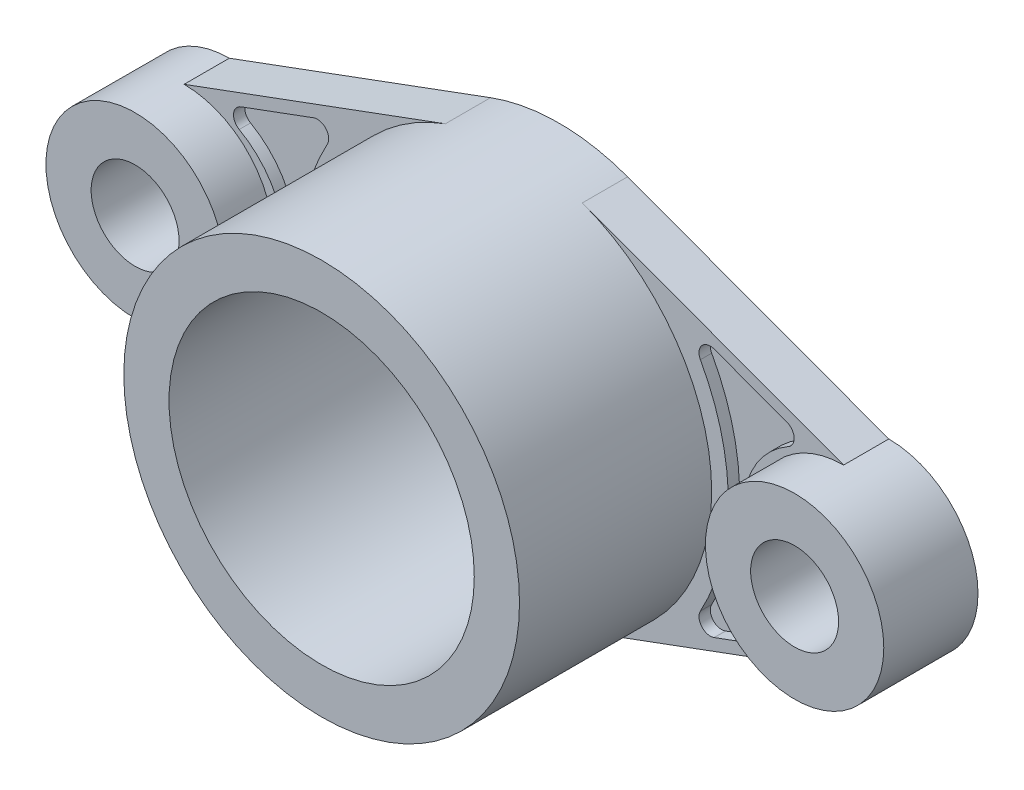
ISO-10303-21;
HEADER;
FILE_DESCRIPTION(('STEP AP214'),'2;1');
FILE_NAME('part.step','',(''),(''),'','','');
FILE_SCHEMA(('AUTOMOTIVE_DESIGN { 1 0 10303 214 1 1 1 1 }'));
ENDSEC;
DATA;
#1=APPLICATION_CONTEXT('core data for automotive mechanical design processes');
#2=APPLICATION_PROTOCOL_DEFINITION('international standard','automotive_design',2000,#1);
#3=PRODUCT_CONTEXT('',#1,'mechanical');
#4=PRODUCT('Part','Part','',(#3));
#5=PRODUCT_RELATED_PRODUCT_CATEGORY('part','',(#4));
#6=PRODUCT_DEFINITION_FORMATION('','',#4);
#7=PRODUCT_DEFINITION_CONTEXT('part definition',#1,'design');
#8=PRODUCT_DEFINITION('design','',#6,#7);
#9=PRODUCT_DEFINITION_SHAPE('','',#8);
#10=(LENGTH_UNIT() NAMED_UNIT(*) SI_UNIT(.MILLI.,.METRE.));
#11=(NAMED_UNIT(*) PLANE_ANGLE_UNIT() SI_UNIT($,.RADIAN.));
#12=(NAMED_UNIT(*) SI_UNIT($,.STERADIAN.) SOLID_ANGLE_UNIT());
#13=UNCERTAINTY_MEASURE_WITH_UNIT(LENGTH_MEASURE(1.E-05),#10,'distance_accuracy_value','');
#14=(GEOMETRIC_REPRESENTATION_CONTEXT(3) GLOBAL_UNCERTAINTY_ASSIGNED_CONTEXT((#13)) GLOBAL_UNIT_ASSIGNED_CONTEXT((#10,
#11,#12)) REPRESENTATION_CONTEXT('',''));
#15=CARTESIAN_POINT('',(0.,0.,0.));
#16=DIRECTION('',(0.,0.,1.));
#17=DIRECTION('',(1.,0.,0.));
#18=AXIS2_PLACEMENT_3D('',#15,#16,#17);
#19=CARTESIAN_POINT('',(0.,0.,63.));
#20=DIRECTION('',(0.,0.,-1.));
#21=DIRECTION('',(-1.,0.,0.));
#22=AXIS2_PLACEMENT_3D('',#19,#20,#21);
#23=CYLINDRICAL_SURFACE('',#22,52.5);
#24=CARTESIAN_POINT('',(0.,0.,63.));
#25=DIRECTION('',(0.,0.,1.));
#26=DIRECTION('',(1.,0.,0.));
#27=AXIS2_PLACEMENT_3D('',#24,#25,#26);
#28=CIRCLE('',#27,52.5);
#29=CARTESIAN_POINT('',(52.5,0.,63.));
#30=VERTEX_POINT('',#29);
#31=EDGE_CURVE('E12',#30,#30,#28,.T.);
#32=ORIENTED_EDGE('',*,*,#31,.F.);
#33=EDGE_LOOP('',(#32));
#34=FACE_BOUND('',#33,.T.);
#35=DIRECTION('',(0.,0.,-1.));
#36=VECTOR('',#35,1.);
#37=CARTESIAN_POINT('',(18.1794500378077,-49.251980633502,12.));
#38=LINE('',#37,#36);
#39=CARTESIAN_POINT('',(18.1794500378077,-49.251980633502,12.));
#40=VERTEX_POINT('',#39);
#41=CARTESIAN_POINT('',(18.1794500378077,-49.251980633502,0.));
#42=VERTEX_POINT('',#41);
#43=EDGE_CURVE('E425',#40,#42,#38,.T.);
#44=ORIENTED_EDGE('',*,*,#43,.F.);
#45=CARTESIAN_POINT('',(0.,0.,12.));
#46=DIRECTION('',(0.,0.,1.));
#47=DIRECTION('',(1.,0.,0.));
#48=AXIS2_PLACEMENT_3D('',#45,#46,#47);
#49=CIRCLE('',#48,52.5);
#50=CARTESIAN_POINT('',(18.1794500378077,49.251980633502,12.));
#51=VERTEX_POINT('',#50);
#52=EDGE_CURVE('E428',#40,#51,#49,.T.);
#53=ORIENTED_EDGE('',*,*,#52,.T.);
#54=DIRECTION('',(0.,0.,-1.));
#55=VECTOR('',#54,1.);
#56=CARTESIAN_POINT('',(18.1794500378077,49.251980633502,12.));
#57=LINE('',#56,#55);
#58=CARTESIAN_POINT('',(18.1794500378077,49.251980633502,0.));
#59=VERTEX_POINT('',#58);
#60=EDGE_CURVE('E423',#51,#59,#57,.T.);
#61=ORIENTED_EDGE('',*,*,#60,.T.);
#62=CARTESIAN_POINT('',(0.,0.,0.));
#63=DIRECTION('',(0.,0.,1.));
#64=DIRECTION('',(1.,0.,0.));
#65=AXIS2_PLACEMENT_3D('',#62,#63,#64);
#66=CIRCLE('',#65,52.5);
#67=CARTESIAN_POINT('',(-18.1794500378077,49.251980633502,0.));
#68=VERTEX_POINT('',#67);
#69=EDGE_CURVE('E487',#59,#68,#66,.T.);
#70=ORIENTED_EDGE('',*,*,#69,.T.);
#71=DIRECTION('',(0.,0.,-1.));
#72=VECTOR('',#71,1.);
#73=CARTESIAN_POINT('',(-18.1794500378077,49.251980633502,12.));
#74=LINE('',#73,#72);
#75=CARTESIAN_POINT('',(-18.1794500378077,49.251980633502,12.));
#76=VERTEX_POINT('',#75);
#77=EDGE_CURVE('E476',#76,#68,#74,.T.);
#78=ORIENTED_EDGE('',*,*,#77,.F.);
#79=CARTESIAN_POINT('',(0.,0.,12.));
#80=DIRECTION('',(0.,0.,1.));
#81=DIRECTION('',(1.,0.,0.));
#82=AXIS2_PLACEMENT_3D('',#79,#80,#81);
#83=CIRCLE('',#82,52.5);
#84=CARTESIAN_POINT('',(-18.1794500378078,-49.251980633502,12.));
#85=VERTEX_POINT('',#84);
#86=EDGE_CURVE('E465',#76,#85,#83,.T.);
#87=ORIENTED_EDGE('',*,*,#86,.T.);
#88=DIRECTION('',(0.,0.,-1.));
#89=VECTOR('',#88,1.);
#90=CARTESIAN_POINT('',(-18.1794500378078,-49.251980633502,12.));
#91=LINE('',#90,#89);
#92=CARTESIAN_POINT('',(-18.1794500378078,-49.251980633502,0.));
#93=VERTEX_POINT('',#92);
#94=EDGE_CURVE('E478',#85,#93,#91,.T.);
#95=ORIENTED_EDGE('',*,*,#94,.T.);
#96=EDGE_CURVE('E120',#93,#42,#66,.T.);
#97=ORIENTED_EDGE('',*,*,#96,.T.);
#98=EDGE_LOOP('',(#44,#53,#61,#70,#78,#87,#95,#97));
#99=FACE_BOUND('',#98,.T.);
#100=ADVANCED_FACE('F113',(#34,#99),#23,.T.);
#101=CARTESIAN_POINT('',(0.,0.,63.));
#102=DIRECTION('',(0.,0.,-1.));
#103=DIRECTION('',(-1.,0.,0.));
#104=AXIS2_PLACEMENT_3D('',#101,#102,#103);
#105=CYLINDRICAL_SURFACE('',#104,40.5);
#106=CARTESIAN_POINT('',(0.,0.,63.));
#107=DIRECTION('',(0.,0.,1.));
#108=DIRECTION('',(1.,0.,0.));
#109=AXIS2_PLACEMENT_3D('',#106,#107,#108);
#110=CIRCLE('',#109,40.5);
#111=CARTESIAN_POINT('',(40.5,0.,63.));
#112=VERTEX_POINT('',#111);
#113=EDGE_CURVE('E125',#112,#112,#110,.T.);
#114=ORIENTED_EDGE('',*,*,#113,.T.);
#115=EDGE_LOOP('',(#114));
#116=FACE_BOUND('',#115,.T.);
#117=CARTESIAN_POINT('',(0.,0.,0.));
#118=DIRECTION('',(0.,0.,1.));
#119=DIRECTION('',(1.,0.,0.));
#120=AXIS2_PLACEMENT_3D('',#117,#118,#119);
#121=CIRCLE('',#120,40.5);
#122=CARTESIAN_POINT('',(40.5,0.,0.));
#123=VERTEX_POINT('',#122);
#124=EDGE_CURVE('E481',#123,#123,#121,.T.);
#125=ORIENTED_EDGE('',*,*,#124,.F.);
#126=EDGE_LOOP('',(#125));
#127=FACE_BOUND('',#126,.T.);
#128=ADVANCED_FACE('F114',(#116,#127),#105,.F.);
#129=CARTESIAN_POINT('',(0.,0.,63.));
#130=DIRECTION('',(0.,0.,1.));
#131=DIRECTION('',(1.,0.,0.));
#132=AXIS2_PLACEMENT_3D('',#129,#130,#131);
#133=PLANE('',#132);
#134=ORIENTED_EDGE('',*,*,#113,.F.);
#135=EDGE_LOOP('',(#134));
#136=FACE_BOUND('',#135,.T.);
#137=ORIENTED_EDGE('',*,*,#31,.T.);
#138=EDGE_LOOP('',(#137));
#139=FACE_BOUND('',#138,.T.);
#140=ADVANCED_FACE('F528',(#136,#139),#133,.T.);
#141=CARTESIAN_POINT('',(0.,0.,0.));
#142=DIRECTION('',(0.,0.,1.));
#143=DIRECTION('',(1.,0.,0.));
#144=AXIS2_PLACEMENT_3D('',#141,#142,#143);
#145=PLANE('',#144);
#146=ORIENTED_EDGE('',*,*,#124,.T.);
#147=EDGE_LOOP('',(#146));
#148=FACE_BOUND('',#147,.T.);
#149=ORIENTED_EDGE('',*,*,#96,.F.);
#150=DIRECTION('',(-0.938132964447656,0.346275238815386,0.));
#151=VECTOR('',#150,1.);
#152=CARTESIAN_POINT('',(-18.1794500378078,-49.251980633502,0.));
#153=LINE('',#152,#151);
#154=CARTESIAN_POINT('',(-87.5,-23.665,0.));
#155=VERTEX_POINT('',#154);
#156=EDGE_CURVE('E452',#93,#155,#153,.T.);
#157=ORIENTED_EDGE('',*,*,#156,.T.);
#158=CARTESIAN_POINT('',(-87.5,0.,0.));
#159=DIRECTION('',(0.,0.,1.));
#160=DIRECTION('',(1.,0.,0.));
#161=AXIS2_PLACEMENT_3D('',#158,#159,#160);
#162=CIRCLE('',#161,23.665);
#163=CARTESIAN_POINT('',(-87.5,23.665,0.));
#164=VERTEX_POINT('',#163);
#165=EDGE_CURVE('E449',#164,#155,#162,.T.);
#166=ORIENTED_EDGE('',*,*,#165,.F.);
#167=DIRECTION('',(0.938132964447656,0.346275238815386,0.));
#168=VECTOR('',#167,1.);
#169=CARTESIAN_POINT('',(-18.1794500378077,49.251980633502,0.));
#170=LINE('',#169,#168);
#171=EDGE_CURVE('E460',#164,#68,#170,.T.);
#172=ORIENTED_EDGE('',*,*,#171,.T.);
#173=ORIENTED_EDGE('',*,*,#69,.F.);
#174=DIRECTION('',(-0.938132964447656,0.346275238815385,0.));
#175=VECTOR('',#174,1.);
#176=CARTESIAN_POINT('',(18.1794500378077,49.251980633502,0.));
#177=LINE('',#176,#175);
#178=CARTESIAN_POINT('',(87.5,23.665,0.));
#179=VERTEX_POINT('',#178);
#180=EDGE_CURVE('E430',#179,#59,#177,.T.);
#181=ORIENTED_EDGE('',*,*,#180,.F.);
#182=CARTESIAN_POINT('',(87.5,0.,0.));
#183=DIRECTION('',(0.,0.,1.));
#184=DIRECTION('',(1.,0.,0.));
#185=AXIS2_PLACEMENT_3D('',#182,#183,#184);
#186=CIRCLE('',#185,23.665);
#187=CARTESIAN_POINT('',(87.5,-23.665,0.));
#188=VERTEX_POINT('',#187);
#189=EDGE_CURVE('E391',#179,#188,#186,.F.);
#190=ORIENTED_EDGE('',*,*,#189,.T.);
#191=DIRECTION('',(0.938132964447656,0.346275238815386,0.));
#192=VECTOR('',#191,1.);
#193=CARTESIAN_POINT('',(18.1794500378078,-49.251980633502,0.));
#194=LINE('',#193,#192);
#195=EDGE_CURVE('E429',#42,#188,#194,.T.);
#196=ORIENTED_EDGE('',*,*,#195,.F.);
#197=EDGE_LOOP('',(#149,#157,#166,#172,#173,#181,#190,#196));
#198=FACE_BOUND('',#197,.T.);
#199=CARTESIAN_POINT('',(-87.5,0.,0.));
#200=DIRECTION('',(0.,0.,1.));
#201=DIRECTION('',(1.,0.,0.));
#202=AXIS2_PLACEMENT_3D('',#199,#200,#201);
#203=CIRCLE('',#202,11.665);
#204=CARTESIAN_POINT('',(-75.835,0.,0.));
#205=VERTEX_POINT('',#204);
#206=EDGE_CURVE('E433',#205,#205,#203,.T.);
#207=ORIENTED_EDGE('',*,*,#206,.T.);
#208=EDGE_LOOP('',(#207));
#209=FACE_BOUND('',#208,.T.);
#210=CARTESIAN_POINT('',(87.5,0.,0.));
#211=DIRECTION('',(0.,0.,1.));
#212=DIRECTION('',(1.,0.,0.));
#213=AXIS2_PLACEMENT_3D('',#210,#211,#212);
#214=CIRCLE('',#213,11.665);
#215=CARTESIAN_POINT('',(99.165,0.,0.));
#216=VERTEX_POINT('',#215);
#217=EDGE_CURVE('E406',#216,#216,#214,.F.);
#218=ORIENTED_EDGE('',*,*,#217,.F.);
#219=EDGE_LOOP('',(#218));
#220=FACE_BOUND('',#219,.T.);
#221=ADVANCED_FACE('F497',(#148,#198,#209,#220),#145,.F.);
#222=CARTESIAN_POINT('',(-18.1794500378078,-49.251980633502,12.));
#223=DIRECTION('',(-0.346275238815386,-0.938132964447656,0.));
#224=DIRECTION('',(0.938132964447656,-0.346275238815386,0.));
#225=AXIS2_PLACEMENT_3D('',#222,#223,#224);
#226=PLANE('',#225);
#227=ORIENTED_EDGE('',*,*,#156,.F.);
#228=ORIENTED_EDGE('',*,*,#94,.F.);
#229=DIRECTION('',(-0.938132964447656,0.346275238815386,0.));
#230=VECTOR('',#229,1.);
#231=CARTESIAN_POINT('',(-18.1794500378078,-49.251980633502,12.));
#232=LINE('',#231,#230);
#233=CARTESIAN_POINT('',(-87.5,-23.665,12.));
#234=VERTEX_POINT('',#233);
#235=EDGE_CURVE('E458',#85,#234,#232,.T.);
#236=ORIENTED_EDGE('',*,*,#235,.T.);
#237=DIRECTION('',(0.,0.,-1.));
#238=VECTOR('',#237,1.);
#239=CARTESIAN_POINT('',(-87.5,-23.665,12.));
#240=LINE('',#239,#238);
#241=EDGE_CURVE('E485',#234,#155,#240,.T.);
#242=ORIENTED_EDGE('',*,*,#241,.T.);
#243=EDGE_LOOP('',(#227,#228,#236,#242));
#244=FACE_BOUND('',#243,.T.);
#245=ADVANCED_FACE('F521',(#244),#226,.T.);
#246=CARTESIAN_POINT('',(-18.1794500378077,49.251980633502,12.));
#247=DIRECTION('',(-0.346275238815386,0.938132964447656,0.));
#248=DIRECTION('',(-0.938132964447656,-0.346275238815386,0.));
#249=AXIS2_PLACEMENT_3D('',#246,#247,#248);
#250=PLANE('',#249);
#251=ORIENTED_EDGE('',*,*,#171,.F.);
#252=DIRECTION('',(0.,0.,-1.));
#253=VECTOR('',#252,1.);
#254=CARTESIAN_POINT('',(-87.5,23.665,12.));
#255=LINE('',#254,#253);
#256=CARTESIAN_POINT('',(-87.5,23.665,12.));
#257=VERTEX_POINT('',#256);
#258=EDGE_CURVE('E469',#257,#164,#255,.T.);
#259=ORIENTED_EDGE('',*,*,#258,.F.);
#260=DIRECTION('',(0.938132964447656,0.346275238815386,0.));
#261=VECTOR('',#260,1.);
#262=CARTESIAN_POINT('',(-18.1794500378077,49.251980633502,12.));
#263=LINE('',#262,#261);
#264=EDGE_CURVE('E467',#257,#76,#263,.T.);
#265=ORIENTED_EDGE('',*,*,#264,.T.);
#266=ORIENTED_EDGE('',*,*,#77,.T.);
#267=EDGE_LOOP('',(#251,#259,#265,#266));
#268=FACE_BOUND('',#267,.T.);
#269=ADVANCED_FACE('F514',(#268),#250,.T.);
#270=CARTESIAN_POINT('',(0.,0.,12.));
#271=DIRECTION('',(0.,0.,1.));
#272=DIRECTION('',(1.,0.,0.));
#273=AXIS2_PLACEMENT_3D('',#270,#271,#272);
#274=PLANE('',#273);
#275=CARTESIAN_POINT('',(-71.3858136016412,-23.2172423019854,12.));
#276=DIRECTION('',(0.,0.,1.));
#277=DIRECTION('',(1.,0.,0.));
#278=AXIS2_PLACEMENT_3D('',#275,#276,#277);
#279=CIRCLE('',#278,2.99999999999999);
#280=CARTESIAN_POINT('',(-72.8612517863431,-20.6051392865736,12.));
#281=VERTEX_POINT('',#280);
#282=CARTESIAN_POINT('',(-72.4246393180874,-26.0316411953284,12.));
#283=VERTEX_POINT('',#282);
#284=EDGE_CURVE('E128',#281,#283,#279,.T.);
#285=ORIENTED_EDGE('',*,*,#284,.F.);
#286=CARTESIAN_POINT('',(-84.5,0.,12.));
#287=DIRECTION('',(0.,0.,1.));
#288=DIRECTION('',(1.,0.,0.));
#289=AXIS2_PLACEMENT_3D('',#286,#287,#288);
#290=CIRCLE('',#289,23.665);
#291=CARTESIAN_POINT('',(-72.8612517863431,20.6051392865736,12.));
#292=VERTEX_POINT('',#291);
#293=EDGE_CURVE('E300',#281,#292,#290,.T.);
#294=ORIENTED_EDGE('',*,*,#293,.T.);
#295=CARTESIAN_POINT('',(-71.3858136016412,23.2172423019854,12.));
#296=DIRECTION('',(0.,0.,1.));
#297=DIRECTION('',(1.,0.,0.));
#298=AXIS2_PLACEMENT_3D('',#295,#296,#297);
#299=CIRCLE('',#298,2.99999999999999);
#300=CARTESIAN_POINT('',(-72.4246393180874,26.0316411953284,12.));
#301=VERTEX_POINT('',#300);
#302=EDGE_CURVE('E297',#301,#292,#299,.T.);
#303=ORIENTED_EDGE('',*,*,#302,.F.);
#304=DIRECTION('',(-0.938132964447657,-0.346275238815385,0.));
#305=VECTOR('',#304,1.);
#306=CARTESIAN_POINT('',(-17.1406243213616,46.437581740159,12.));
#307=LINE('',#306,#305);
#308=CARTESIAN_POINT('',(-53.1673807436977,33.1397080307183,12.));
#309=VERTEX_POINT('',#308);
#310=EDGE_CURVE('E327',#309,#301,#307,.T.);
#311=ORIENTED_EDGE('',*,*,#310,.F.);
#312=CARTESIAN_POINT('',(-52.1285550272516,30.3253091373753,12.));
#313=DIRECTION('',(0.,0.,1.));
#314=DIRECTION('',(1.,0.,0.));
#315=AXIS2_PLACEMENT_3D('',#312,#313,#314);
#316=CIRCLE('',#315,3.);
#317=CARTESIAN_POINT('',(-49.5,28.87938435762,12.));
#318=VERTEX_POINT('',#317);
#319=EDGE_CURVE('E321',#318,#309,#316,.T.);
#320=ORIENTED_EDGE('',*,*,#319,.F.);
#321=CARTESIAN_POINT('',(3.,0.,12.));
#322=DIRECTION('',(0.,0.,1.));
#323=DIRECTION('',(1.,0.,0.));
#324=AXIS2_PLACEMENT_3D('',#321,#322,#323);
#325=CIRCLE('',#324,59.9188521324895);
#326=CARTESIAN_POINT('',(-49.5,-28.87938435762,12.));
#327=VERTEX_POINT('',#326);
#328=EDGE_CURVE('E322',#318,#327,#325,.T.);
#329=ORIENTED_EDGE('',*,*,#328,.T.);
#330=CARTESIAN_POINT('',(-52.1285550272516,-30.3253091373753,12.));
#331=DIRECTION('',(0.,0.,1.));
#332=DIRECTION('',(1.,0.,0.));
#333=AXIS2_PLACEMENT_3D('',#330,#331,#332);
#334=CIRCLE('',#333,3.);
#335=CARTESIAN_POINT('',(-53.1673807436977,-33.1397080307183,12.));
#336=VERTEX_POINT('',#335);
#337=EDGE_CURVE('E319',#336,#327,#334,.T.);
#338=ORIENTED_EDGE('',*,*,#337,.F.);
#339=DIRECTION('',(-0.938132964447657,0.346275238815385,0.));
#340=VECTOR('',#339,1.);
#341=CARTESIAN_POINT('',(-17.1406243213616,-46.437581740159,12.));
#342=LINE('',#341,#340);
#343=EDGE_CURVE('E317',#336,#283,#342,.T.);
#344=ORIENTED_EDGE('',*,*,#343,.T.);
#345=EDGE_LOOP('',(#285,#294,#303,#311,#320,#329,#338,#344));
#346=FACE_BOUND('',#345,.T.);
#347=CARTESIAN_POINT('',(-87.5,0.,12.));
#348=DIRECTION('',(0.,0.,1.));
#349=DIRECTION('',(1.,0.,0.));
#350=AXIS2_PLACEMENT_3D('',#347,#348,#349);
#351=CIRCLE('',#350,23.665);
#352=EDGE_CURVE('E456',#234,#257,#351,.T.);
#353=ORIENTED_EDGE('',*,*,#352,.F.);
#354=ORIENTED_EDGE('',*,*,#235,.F.);
#355=ORIENTED_EDGE('',*,*,#86,.F.);
#356=ORIENTED_EDGE('',*,*,#264,.F.);
#357=EDGE_LOOP('',(#353,#354,#355,#356));
#358=FACE_BOUND('',#357,.T.);
#359=ADVANCED_FACE('F516',(#346,#358),#274,.T.);
#360=CARTESIAN_POINT('',(-87.5,0.,25.));
#361=DIRECTION('',(0.,0.,-1.));
#362=DIRECTION('',(-1.,0.,0.));
#363=AXIS2_PLACEMENT_3D('',#360,#361,#362);
#364=CYLINDRICAL_SURFACE('',#363,11.665);
#365=CARTESIAN_POINT('',(-87.5,0.,25.));
#366=DIRECTION('',(0.,0.,1.));
#367=DIRECTION('',(1.,0.,0.));
#368=AXIS2_PLACEMENT_3D('',#365,#366,#367);
#369=CIRCLE('',#368,11.665);
#370=CARTESIAN_POINT('',(-75.835,0.,25.));
#371=VERTEX_POINT('',#370);
#372=EDGE_CURVE('E443',#371,#371,#369,.T.);
#373=ORIENTED_EDGE('',*,*,#372,.T.);
#374=EDGE_LOOP('',(#373));
#375=FACE_BOUND('',#374,.T.);
#376=ORIENTED_EDGE('',*,*,#206,.F.);
#377=EDGE_LOOP('',(#376));
#378=FACE_BOUND('',#377,.T.);
#379=ADVANCED_FACE('F562',(#375,#378),#364,.F.);
#380=CARTESIAN_POINT('',(-87.5,0.,25.));
#381=DIRECTION('',(0.,0.,-1.));
#382=DIRECTION('',(-1.,0.,0.));
#383=AXIS2_PLACEMENT_3D('',#380,#381,#382);
#384=CYLINDRICAL_SURFACE('',#383,23.665);
#385=ORIENTED_EDGE('',*,*,#241,.F.);
#386=ORIENTED_EDGE('',*,*,#352,.T.);
#387=ORIENTED_EDGE('',*,*,#258,.T.);
#388=ORIENTED_EDGE('',*,*,#165,.T.);
#389=EDGE_LOOP('',(#385,#386,#387,#388));
#390=FACE_BOUND('',#389,.T.);
#391=CARTESIAN_POINT('',(-87.5,0.,25.));
#392=DIRECTION('',(0.,0.,1.));
#393=DIRECTION('',(1.,0.,0.));
#394=AXIS2_PLACEMENT_3D('',#391,#392,#393);
#395=CIRCLE('',#394,23.665);
#396=CARTESIAN_POINT('',(-63.835,0.,25.));
#397=VERTEX_POINT('',#396);
#398=EDGE_CURVE('E450',#397,#397,#395,.T.);
#399=ORIENTED_EDGE('',*,*,#398,.F.);
#400=EDGE_LOOP('',(#399));
#401=FACE_BOUND('',#400,.T.);
#402=ADVANCED_FACE('F517',(#390,#401),#384,.T.);
#403=CARTESIAN_POINT('',(0.,0.,25.));
#404=DIRECTION('',(0.,0.,1.));
#405=DIRECTION('',(1.,0.,0.));
#406=AXIS2_PLACEMENT_3D('',#403,#404,#405);
#407=PLANE('',#406);
#408=ORIENTED_EDGE('',*,*,#372,.F.);
#409=EDGE_LOOP('',(#408));
#410=FACE_BOUND('',#409,.T.);
#411=ORIENTED_EDGE('',*,*,#398,.T.);
#412=EDGE_LOOP('',(#411));
#413=FACE_BOUND('',#412,.T.);
#414=ADVANCED_FACE('F580',(#410,#413),#407,.T.);
#415=CARTESIAN_POINT('',(18.1794500378077,49.251980633502,12.));
#416=DIRECTION('',(-0.346275238815385,-0.938132964447656,0.));
#417=DIRECTION('',(0.938132964447656,-0.346275238815385,0.));
#418=AXIS2_PLACEMENT_3D('',#415,#416,#417);
#419=PLANE('',#418);
#420=ORIENTED_EDGE('',*,*,#180,.T.);
#421=ORIENTED_EDGE('',*,*,#60,.F.);
#422=DIRECTION('',(-0.938132964447656,0.346275238815385,0.));
#423=VECTOR('',#422,1.);
#424=CARTESIAN_POINT('',(18.1794500378077,49.251980633502,12.));
#425=LINE('',#424,#423);
#426=CARTESIAN_POINT('',(87.5,23.665,12.));
#427=VERTEX_POINT('',#426);
#428=EDGE_CURVE('E436',#427,#51,#425,.T.);
#429=ORIENTED_EDGE('',*,*,#428,.F.);
#430=DIRECTION('',(0.,0.,-1.));
#431=VECTOR('',#430,1.);
#432=CARTESIAN_POINT('',(87.5,23.665,12.));
#433=LINE('',#432,#431);
#434=EDGE_CURVE('E419',#427,#179,#433,.T.);
#435=ORIENTED_EDGE('',*,*,#434,.T.);
#436=EDGE_LOOP('',(#420,#421,#429,#435));
#437=FACE_BOUND('',#436,.T.);
#438=ADVANCED_FACE('F586',(#437),#419,.F.);
#439=CARTESIAN_POINT('',(18.1794500378078,-49.251980633502,12.));
#440=DIRECTION('',(-0.346275238815386,0.938132964447656,0.));
#441=DIRECTION('',(-0.938132964447656,-0.346275238815386,0.));
#442=AXIS2_PLACEMENT_3D('',#439,#440,#441);
#443=PLANE('',#442);
#444=ORIENTED_EDGE('',*,*,#195,.T.);
#445=DIRECTION('',(0.,0.,-1.));
#446=VECTOR('',#445,1.);
#447=CARTESIAN_POINT('',(87.5,-23.665,12.));
#448=LINE('',#447,#446);
#449=CARTESIAN_POINT('',(87.5,-23.665,12.));
#450=VERTEX_POINT('',#449);
#451=EDGE_CURVE('E412',#450,#188,#448,.T.);
#452=ORIENTED_EDGE('',*,*,#451,.F.);
#453=DIRECTION('',(0.938132964447656,0.346275238815386,0.));
#454=VECTOR('',#453,1.);
#455=CARTESIAN_POINT('',(18.1794500378078,-49.251980633502,12.));
#456=LINE('',#455,#454);
#457=EDGE_CURVE('E427',#40,#450,#456,.T.);
#458=ORIENTED_EDGE('',*,*,#457,.F.);
#459=ORIENTED_EDGE('',*,*,#43,.T.);
#460=EDGE_LOOP('',(#444,#452,#458,#459));
#461=FACE_BOUND('',#460,.T.);
#462=ADVANCED_FACE('F504',(#461),#443,.F.);
#463=CARTESIAN_POINT('',(0.,0.,12.));
#464=DIRECTION('',(0.,0.,1.));
#465=DIRECTION('',(1.,0.,0.));
#466=AXIS2_PLACEMENT_3D('',#463,#464,#465);
#467=PLANE('',#466);
#468=CARTESIAN_POINT('',(71.3858136016412,23.2172423019855,12.));
#469=DIRECTION('',(0.,0.,1.));
#470=DIRECTION('',(1.,0.,0.));
#471=AXIS2_PLACEMENT_3D('',#468,#469,#470);
#472=CIRCLE('',#471,2.99999999999999);
#473=CARTESIAN_POINT('',(72.8612517863431,20.6051392865736,12.));
#474=VERTEX_POINT('',#473);
#475=CARTESIAN_POINT('',(72.4246393180873,26.0316411953284,12.));
#476=VERTEX_POINT('',#475);
#477=EDGE_CURVE('E140',#474,#476,#472,.T.);
#478=ORIENTED_EDGE('',*,*,#477,.F.);
#479=CARTESIAN_POINT('',(84.4999999999999,0.,12.));
#480=DIRECTION('',(0.,0.,1.));
#481=DIRECTION('',(1.,0.,0.));
#482=AXIS2_PLACEMENT_3D('',#479,#480,#481);
#483=CIRCLE('',#482,23.665);
#484=CARTESIAN_POINT('',(72.8612517863431,-20.6051392865736,12.));
#485=VERTEX_POINT('',#484);
#486=EDGE_CURVE('E348',#474,#485,#483,.T.);
#487=ORIENTED_EDGE('',*,*,#486,.T.);
#488=CARTESIAN_POINT('',(71.3858136016412,-23.2172423019854,12.));
#489=DIRECTION('',(0.,0.,1.));
#490=DIRECTION('',(1.,0.,0.));
#491=AXIS2_PLACEMENT_3D('',#488,#489,#490);
#492=CIRCLE('',#491,2.99999999999999);
#493=CARTESIAN_POINT('',(72.4246393180874,-26.0316411953284,12.));
#494=VERTEX_POINT('',#493);
#495=EDGE_CURVE('E381',#494,#485,#492,.T.);
#496=ORIENTED_EDGE('',*,*,#495,.F.);
#497=DIRECTION('',(0.938132964447657,0.346275238815385,0.));
#498=VECTOR('',#497,1.);
#499=CARTESIAN_POINT('',(17.1406243213615,-46.4375817401589,12.));
#500=LINE('',#499,#498);
#501=CARTESIAN_POINT('',(53.1673807436977,-33.1397080307182,12.));
#502=VERTEX_POINT('',#501);
#503=EDGE_CURVE('E382',#502,#494,#500,.T.);
#504=ORIENTED_EDGE('',*,*,#503,.F.);
#505=CARTESIAN_POINT('',(52.1285550272516,-30.3253091373753,12.));
#506=DIRECTION('',(0.,0.,1.));
#507=DIRECTION('',(1.,0.,0.));
#508=AXIS2_PLACEMENT_3D('',#505,#506,#507);
#509=CIRCLE('',#508,3.);
#510=CARTESIAN_POINT('',(49.5,-28.87938435762,12.));
#511=VERTEX_POINT('',#510);
#512=EDGE_CURVE('E377',#511,#502,#509,.T.);
#513=ORIENTED_EDGE('',*,*,#512,.F.);
#514=CARTESIAN_POINT('',(-3.00000000000003,0.,12.));
#515=DIRECTION('',(0.,0.,1.));
#516=DIRECTION('',(1.,0.,0.));
#517=AXIS2_PLACEMENT_3D('',#514,#515,#516);
#518=CIRCLE('',#517,59.9188521324895);
#519=CARTESIAN_POINT('',(49.5,28.87938435762,12.));
#520=VERTEX_POINT('',#519);
#521=EDGE_CURVE('E374',#511,#520,#518,.T.);
#522=ORIENTED_EDGE('',*,*,#521,.T.);
#523=CARTESIAN_POINT('',(52.1285550272516,30.3253091373753,12.));
#524=DIRECTION('',(0.,0.,1.));
#525=DIRECTION('',(1.,0.,0.));
#526=AXIS2_PLACEMENT_3D('',#523,#524,#525);
#527=CIRCLE('',#526,3.);
#528=CARTESIAN_POINT('',(53.1673807436977,33.1397080307183,12.));
#529=VERTEX_POINT('',#528);
#530=EDGE_CURVE('E375',#529,#520,#527,.T.);
#531=ORIENTED_EDGE('',*,*,#530,.F.);
#532=DIRECTION('',(0.938132964447657,-0.346275238815384,0.));
#533=VECTOR('',#532,1.);
#534=CARTESIAN_POINT('',(17.1406243213615,46.437581740159,12.));
#535=LINE('',#534,#533);
#536=EDGE_CURVE('E367',#529,#476,#535,.T.);
#537=ORIENTED_EDGE('',*,*,#536,.T.);
#538=EDGE_LOOP('',(#478,#487,#496,#504,#513,#522,#531,#537));
#539=FACE_BOUND('',#538,.T.);
#540=ORIENTED_EDGE('',*,*,#457,.T.);
#541=CARTESIAN_POINT('',(87.5,0.,12.));
#542=DIRECTION('',(0.,0.,1.));
#543=DIRECTION('',(1.,0.,0.));
#544=AXIS2_PLACEMENT_3D('',#541,#542,#543);
#545=CIRCLE('',#544,23.665);
#546=EDGE_CURVE('E437',#450,#427,#545,.F.);
#547=ORIENTED_EDGE('',*,*,#546,.T.);
#548=ORIENTED_EDGE('',*,*,#428,.T.);
#549=ORIENTED_EDGE('',*,*,#52,.F.);
#550=EDGE_LOOP('',(#540,#547,#548,#549));
#551=FACE_BOUND('',#550,.T.);
#552=ADVANCED_FACE('F507',(#539,#551),#467,.T.);
#553=CARTESIAN_POINT('',(87.5,0.,25.));
#554=DIRECTION('',(0.,0.,-1.));
#555=DIRECTION('',(-1.,0.,0.));
#556=AXIS2_PLACEMENT_3D('',#553,#554,#555);
#557=CYLINDRICAL_SURFACE('',#556,23.665);
#558=CARTESIAN_POINT('',(87.5,0.,25.));
#559=DIRECTION('',(0.,0.,1.));
#560=DIRECTION('',(1.,0.,0.));
#561=AXIS2_PLACEMENT_3D('',#558,#559,#560);
#562=CIRCLE('',#561,23.665);
#563=CARTESIAN_POINT('',(111.165,0.,25.));
#564=VERTEX_POINT('',#563);
#565=EDGE_CURVE('E403',#564,#564,#562,.F.);
#566=ORIENTED_EDGE('',*,*,#565,.T.);
#567=EDGE_LOOP('',(#566));
#568=FACE_BOUND('',#567,.T.);
#569=ORIENTED_EDGE('',*,*,#434,.F.);
#570=ORIENTED_EDGE('',*,*,#546,.F.);
#571=ORIENTED_EDGE('',*,*,#451,.T.);
#572=ORIENTED_EDGE('',*,*,#189,.F.);
#573=EDGE_LOOP('',(#569,#570,#571,#572));
#574=FACE_BOUND('',#573,.T.);
#575=ADVANCED_FACE('F596',(#568,#574),#557,.T.);
#576=CARTESIAN_POINT('',(87.5,0.,25.));
#577=DIRECTION('',(0.,0.,-1.));
#578=DIRECTION('',(-1.,0.,0.));
#579=AXIS2_PLACEMENT_3D('',#576,#577,#578);
#580=CYLINDRICAL_SURFACE('',#579,11.665);
#581=CARTESIAN_POINT('',(87.5,0.,25.));
#582=DIRECTION('',(0.,0.,1.));
#583=DIRECTION('',(1.,0.,0.));
#584=AXIS2_PLACEMENT_3D('',#581,#582,#583);
#585=CIRCLE('',#584,11.665);
#586=CARTESIAN_POINT('',(99.165,0.,25.));
#587=VERTEX_POINT('',#586);
#588=EDGE_CURVE('E409',#587,#587,#585,.F.);
#589=ORIENTED_EDGE('',*,*,#588,.F.);
#590=EDGE_LOOP('',(#589));
#591=FACE_BOUND('',#590,.T.);
#592=ORIENTED_EDGE('',*,*,#217,.T.);
#593=EDGE_LOOP('',(#592));
#594=FACE_BOUND('',#593,.T.);
#595=ADVANCED_FACE('F605',(#591,#594),#580,.F.);
#596=CARTESIAN_POINT('',(0.,0.,25.));
#597=DIRECTION('',(0.,0.,1.));
#598=DIRECTION('',(1.,0.,0.));
#599=AXIS2_PLACEMENT_3D('',#596,#597,#598);
#600=PLANE('',#599);
#601=ORIENTED_EDGE('',*,*,#565,.F.);
#602=EDGE_LOOP('',(#601));
#603=FACE_BOUND('',#602,.T.);
#604=ORIENTED_EDGE('',*,*,#588,.T.);
#605=EDGE_LOOP('',(#604));
#606=FACE_BOUND('',#605,.T.);
#607=ADVANCED_FACE('F612',(#603,#606),#600,.T.);
#608=CARTESIAN_POINT('',(71.3858136016412,23.2172423019855,9.));
#609=DIRECTION('',(0.,0.,1.));
#610=DIRECTION('',(1.,0.,0.));
#611=AXIS2_PLACEMENT_3D('',#608,#609,#610);
#612=CYLINDRICAL_SURFACE('',#611,2.99999999999999);
#613=ORIENTED_EDGE('',*,*,#477,.T.);
#614=DIRECTION('',(0.,0.,1.));
#615=VECTOR('',#614,1.);
#616=CARTESIAN_POINT('',(72.4246393180873,26.0316411953284,9.));
#617=LINE('',#616,#615);
#618=CARTESIAN_POINT('',(72.4246393180873,26.0316411953284,9.));
#619=VERTEX_POINT('',#618);
#620=EDGE_CURVE('E370',#619,#476,#617,.T.);
#621=ORIENTED_EDGE('',*,*,#620,.F.);
#622=CARTESIAN_POINT('',(71.3858136016412,23.2172423019855,9.));
#623=DIRECTION('',(0.,0.,1.));
#624=DIRECTION('',(1.,0.,0.));
#625=AXIS2_PLACEMENT_3D('',#622,#623,#624);
#626=CIRCLE('',#625,2.99999999999999);
#627=CARTESIAN_POINT('',(72.8612517863431,20.6051392865736,9.));
#628=VERTEX_POINT('',#627);
#629=EDGE_CURVE('E343',#628,#619,#626,.T.);
#630=ORIENTED_EDGE('',*,*,#629,.F.);
#631=DIRECTION('',(0.,0.,1.));
#632=VECTOR('',#631,1.);
#633=CARTESIAN_POINT('',(72.8612517863431,20.6051392865736,9.));
#634=LINE('',#633,#632);
#635=EDGE_CURVE('E386',#628,#474,#634,.T.);
#636=ORIENTED_EDGE('',*,*,#635,.T.);
#637=EDGE_LOOP('',(#613,#621,#630,#636));
#638=FACE_BOUND('',#637,.T.);
#639=ADVANCED_FACE('F623',(#638),#612,.F.);
#640=CARTESIAN_POINT('',(84.4999999999999,0.,9.));
#641=DIRECTION('',(0.,0.,1.));
#642=DIRECTION('',(1.,0.,0.));
#643=AXIS2_PLACEMENT_3D('',#640,#641,#642);
#644=CYLINDRICAL_SURFACE('',#643,23.665);
#645=ORIENTED_EDGE('',*,*,#486,.F.);
#646=ORIENTED_EDGE('',*,*,#635,.F.);
#647=CARTESIAN_POINT('',(84.4999999999999,0.,9.));
#648=DIRECTION('',(0.,0.,1.));
#649=DIRECTION('',(1.,0.,0.));
#650=AXIS2_PLACEMENT_3D('',#647,#648,#649);
#651=CIRCLE('',#650,23.665);
#652=CARTESIAN_POINT('',(72.8612517863431,-20.6051392865736,9.));
#653=VERTEX_POINT('',#652);
#654=EDGE_CURVE('E362',#628,#653,#651,.T.);
#655=ORIENTED_EDGE('',*,*,#654,.T.);
#656=DIRECTION('',(0.,0.,1.));
#657=VECTOR('',#656,1.);
#658=CARTESIAN_POINT('',(72.8612517863431,-20.6051392865736,9.));
#659=LINE('',#658,#657);
#660=EDGE_CURVE('E392',#653,#485,#659,.T.);
#661=ORIENTED_EDGE('',*,*,#660,.T.);
#662=EDGE_LOOP('',(#645,#646,#655,#661));
#663=FACE_BOUND('',#662,.T.);
#664=ADVANCED_FACE('F674',(#663),#644,.T.);
#665=CARTESIAN_POINT('',(71.3858136016412,-23.2172423019854,9.));
#666=DIRECTION('',(0.,0.,1.));
#667=DIRECTION('',(1.,0.,0.));
#668=AXIS2_PLACEMENT_3D('',#665,#666,#667);
#669=CYLINDRICAL_SURFACE('',#668,2.99999999999999);
#670=ORIENTED_EDGE('',*,*,#495,.T.);
#671=ORIENTED_EDGE('',*,*,#660,.F.);
#672=CARTESIAN_POINT('',(71.3858136016412,-23.2172423019854,9.));
#673=DIRECTION('',(0.,0.,1.));
#674=DIRECTION('',(1.,0.,0.));
#675=AXIS2_PLACEMENT_3D('',#672,#673,#674);
#676=CIRCLE('',#675,2.99999999999999);
#677=CARTESIAN_POINT('',(72.4246393180874,-26.0316411953284,9.));
#678=VERTEX_POINT('',#677);
#679=EDGE_CURVE('E365',#678,#653,#676,.T.);
#680=ORIENTED_EDGE('',*,*,#679,.F.);
#681=DIRECTION('',(0.,0.,1.));
#682=VECTOR('',#681,1.);
#683=CARTESIAN_POINT('',(72.4246393180874,-26.0316411953284,9.));
#684=LINE('',#683,#682);
#685=EDGE_CURVE('E393',#678,#494,#684,.T.);
#686=ORIENTED_EDGE('',*,*,#685,.T.);
#687=EDGE_LOOP('',(#670,#671,#680,#686));
#688=FACE_BOUND('',#687,.T.);
#689=ADVANCED_FACE('F683',(#688),#669,.F.);
#690=CARTESIAN_POINT('',(17.1406243213615,-46.4375817401589,9.));
#691=DIRECTION('',(0.346275238815385,-0.938132964447657,0.));
#692=DIRECTION('',(0.938132964447657,0.346275238815385,0.));
#693=AXIS2_PLACEMENT_3D('',#690,#691,#692);
#694=PLANE('',#693);
#695=ORIENTED_EDGE('',*,*,#503,.T.);
#696=ORIENTED_EDGE('',*,*,#685,.F.);
#697=DIRECTION('',(0.938132964447657,0.346275238815385,0.));
#698=VECTOR('',#697,1.);
#699=CARTESIAN_POINT('',(17.1406243213615,-46.4375817401589,9.));
#700=LINE('',#699,#698);
#701=CARTESIAN_POINT('',(53.1673807436977,-33.1397080307182,9.));
#702=VERTEX_POINT('',#701);
#703=EDGE_CURVE('E360',#702,#678,#700,.T.);
#704=ORIENTED_EDGE('',*,*,#703,.F.);
#705=DIRECTION('',(0.,0.,1.));
#706=VECTOR('',#705,1.);
#707=CARTESIAN_POINT('',(53.1673807436977,-33.1397080307182,9.));
#708=LINE('',#707,#706);
#709=EDGE_CURVE('E399',#702,#502,#708,.T.);
#710=ORIENTED_EDGE('',*,*,#709,.T.);
#711=EDGE_LOOP('',(#695,#696,#704,#710));
#712=FACE_BOUND('',#711,.T.);
#713=ADVANCED_FACE('F687',(#712),#694,.F.);
#714=CARTESIAN_POINT('',(52.1285550272516,-30.3253091373753,9.));
#715=DIRECTION('',(0.,0.,1.));
#716=DIRECTION('',(1.,0.,0.));
#717=AXIS2_PLACEMENT_3D('',#714,#715,#716);
#718=CYLINDRICAL_SURFACE('',#717,3.);
#719=ORIENTED_EDGE('',*,*,#512,.T.);
#720=ORIENTED_EDGE('',*,*,#709,.F.);
#721=CARTESIAN_POINT('',(52.1285550272516,-30.3253091373753,9.));
#722=DIRECTION('',(0.,0.,1.));
#723=DIRECTION('',(1.,0.,0.));
#724=AXIS2_PLACEMENT_3D('',#721,#722,#723);
#725=CIRCLE('',#724,3.);
#726=CARTESIAN_POINT('',(49.5,-28.87938435762,9.));
#727=VERTEX_POINT('',#726);
#728=EDGE_CURVE('E358',#727,#702,#725,.T.);
#729=ORIENTED_EDGE('',*,*,#728,.F.);
#730=DIRECTION('',(0.,0.,1.));
#731=VECTOR('',#730,1.);
#732=CARTESIAN_POINT('',(49.5,-28.87938435762,9.));
#733=LINE('',#732,#731);
#734=EDGE_CURVE('E400',#727,#511,#733,.T.);
#735=ORIENTED_EDGE('',*,*,#734,.T.);
#736=EDGE_LOOP('',(#719,#720,#729,#735));
#737=FACE_BOUND('',#736,.T.);
#738=ADVANCED_FACE('F697',(#737),#718,.F.);
#739=CARTESIAN_POINT('',(-3.00000000000003,0.,9.));
#740=DIRECTION('',(0.,0.,1.));
#741=DIRECTION('',(1.,0.,0.));
#742=AXIS2_PLACEMENT_3D('',#739,#740,#741);
#743=CYLINDRICAL_SURFACE('',#742,59.9188521324895);
#744=ORIENTED_EDGE('',*,*,#521,.F.);
#745=ORIENTED_EDGE('',*,*,#734,.F.);
#746=CARTESIAN_POINT('',(-3.00000000000003,0.,9.));
#747=DIRECTION('',(0.,0.,1.));
#748=DIRECTION('',(1.,0.,0.));
#749=AXIS2_PLACEMENT_3D('',#746,#747,#748);
#750=CIRCLE('',#749,59.9188521324895);
#751=CARTESIAN_POINT('',(49.5,28.87938435762,9.));
#752=VERTEX_POINT('',#751);
#753=EDGE_CURVE('E351',#727,#752,#750,.T.);
#754=ORIENTED_EDGE('',*,*,#753,.T.);
#755=DIRECTION('',(0.,0.,1.));
#756=VECTOR('',#755,1.);
#757=CARTESIAN_POINT('',(49.5,28.87938435762,9.));
#758=LINE('',#757,#756);
#759=EDGE_CURVE('E397',#752,#520,#758,.T.);
#760=ORIENTED_EDGE('',*,*,#759,.T.);
#761=EDGE_LOOP('',(#744,#745,#754,#760));
#762=FACE_BOUND('',#761,.T.);
#763=ADVANCED_FACE('F709',(#762),#743,.T.);
#764=CARTESIAN_POINT('',(52.1285550272516,30.3253091373753,9.));
#765=DIRECTION('',(0.,0.,1.));
#766=DIRECTION('',(1.,0.,0.));
#767=AXIS2_PLACEMENT_3D('',#764,#765,#766);
#768=CYLINDRICAL_SURFACE('',#767,3.);
#769=ORIENTED_EDGE('',*,*,#530,.T.);
#770=ORIENTED_EDGE('',*,*,#759,.F.);
#771=CARTESIAN_POINT('',(52.1285550272516,30.3253091373753,9.));
#772=DIRECTION('',(0.,0.,1.));
#773=DIRECTION('',(1.,0.,0.));
#774=AXIS2_PLACEMENT_3D('',#771,#772,#773);
#775=CIRCLE('',#774,3.);
#776=CARTESIAN_POINT('',(53.1673807436977,33.1397080307183,9.));
#777=VERTEX_POINT('',#776);
#778=EDGE_CURVE('E352',#777,#752,#775,.T.);
#779=ORIENTED_EDGE('',*,*,#778,.F.);
#780=DIRECTION('',(0.,0.,1.));
#781=VECTOR('',#780,1.);
#782=CARTESIAN_POINT('',(53.1673807436977,33.1397080307183,9.));
#783=LINE('',#782,#781);
#784=EDGE_CURVE('E405',#777,#529,#783,.T.);
#785=ORIENTED_EDGE('',*,*,#784,.T.);
#786=EDGE_LOOP('',(#769,#770,#779,#785));
#787=FACE_BOUND('',#786,.T.);
#788=ADVANCED_FACE('F717',(#787),#768,.F.);
#789=CARTESIAN_POINT('',(17.1406243213615,46.437581740159,9.));
#790=DIRECTION('',(-0.346275238815384,-0.938132964447657,0.));
#791=DIRECTION('',(0.938132964447657,-0.346275238815384,0.));
#792=AXIS2_PLACEMENT_3D('',#789,#790,#791);
#793=PLANE('',#792);
#794=ORIENTED_EDGE('',*,*,#536,.F.);
#795=ORIENTED_EDGE('',*,*,#784,.F.);
#796=DIRECTION('',(0.938132964447657,-0.346275238815384,0.));
#797=VECTOR('',#796,1.);
#798=CARTESIAN_POINT('',(17.1406243213615,46.437581740159,9.));
#799=LINE('',#798,#797);
#800=EDGE_CURVE('E349',#777,#619,#799,.T.);
#801=ORIENTED_EDGE('',*,*,#800,.T.);
#802=ORIENTED_EDGE('',*,*,#620,.T.);
#803=EDGE_LOOP('',(#794,#795,#801,#802));
#804=FACE_BOUND('',#803,.T.);
#805=ADVANCED_FACE('F727',(#804),#793,.T.);
#806=CARTESIAN_POINT('',(71.3858136016412,23.2172423019855,9.));
#807=DIRECTION('',(0.,0.,1.));
#808=DIRECTION('',(1.,0.,0.));
#809=AXIS2_PLACEMENT_3D('',#806,#807,#808);
#810=PLANE('',#809);
#811=ORIENTED_EDGE('',*,*,#629,.T.);
#812=ORIENTED_EDGE('',*,*,#800,.F.);
#813=ORIENTED_EDGE('',*,*,#778,.T.);
#814=ORIENTED_EDGE('',*,*,#753,.F.);
#815=ORIENTED_EDGE('',*,*,#728,.T.);
#816=ORIENTED_EDGE('',*,*,#703,.T.);
#817=ORIENTED_EDGE('',*,*,#679,.T.);
#818=ORIENTED_EDGE('',*,*,#654,.F.);
#819=EDGE_LOOP('',(#811,#812,#813,#814,#815,#816,#817,#818));
#820=FACE_BOUND('',#819,.T.);
#821=ADVANCED_FACE('F733',(#820),#810,.T.);
#822=CARTESIAN_POINT('',(-71.3858136016412,-23.2172423019854,9.));
#823=DIRECTION('',(0.,0.,1.));
#824=DIRECTION('',(1.,0.,0.));
#825=AXIS2_PLACEMENT_3D('',#822,#823,#824);
#826=CYLINDRICAL_SURFACE('',#825,2.99999999999999);
#827=ORIENTED_EDGE('',*,*,#284,.T.);
#828=DIRECTION('',(0.,0.,1.));
#829=VECTOR('',#828,1.);
#830=CARTESIAN_POINT('',(-72.4246393180874,-26.0316411953284,9.));
#831=LINE('',#830,#829);
#832=CARTESIAN_POINT('',(-72.4246393180874,-26.0316411953284,9.));
#833=VERTEX_POINT('',#832);
#834=EDGE_CURVE('E278',#833,#283,#831,.T.);
#835=ORIENTED_EDGE('',*,*,#834,.F.);
#836=CARTESIAN_POINT('',(-71.3858136016412,-23.2172423019854,9.));
#837=DIRECTION('',(0.,0.,1.));
#838=DIRECTION('',(1.,0.,0.));
#839=AXIS2_PLACEMENT_3D('',#836,#837,#838);
#840=CIRCLE('',#839,2.99999999999999);
#841=CARTESIAN_POINT('',(-72.8612517863431,-20.6051392865736,9.));
#842=VERTEX_POINT('',#841);
#843=EDGE_CURVE('E289',#842,#833,#840,.T.);
#844=ORIENTED_EDGE('',*,*,#843,.F.);
#845=DIRECTION('',(0.,0.,1.));
#846=VECTOR('',#845,1.);
#847=CARTESIAN_POINT('',(-72.8612517863431,-20.6051392865736,9.));
#848=LINE('',#847,#846);
#849=EDGE_CURVE('E331',#842,#281,#848,.T.);
#850=ORIENTED_EDGE('',*,*,#849,.T.);
#851=EDGE_LOOP('',(#827,#835,#844,#850));
#852=FACE_BOUND('',#851,.T.);
#853=ADVANCED_FACE('F293',(#852),#826,.F.);
#854=CARTESIAN_POINT('',(-84.5,0.,9.));
#855=DIRECTION('',(0.,0.,1.));
#856=DIRECTION('',(1.,0.,0.));
#857=AXIS2_PLACEMENT_3D('',#854,#855,#856);
#858=CYLINDRICAL_SURFACE('',#857,23.665);
#859=ORIENTED_EDGE('',*,*,#293,.F.);
#860=ORIENTED_EDGE('',*,*,#849,.F.);
#861=CARTESIAN_POINT('',(-84.5,0.,9.));
#862=DIRECTION('',(0.,0.,1.));
#863=DIRECTION('',(1.,0.,0.));
#864=AXIS2_PLACEMENT_3D('',#861,#862,#863);
#865=CIRCLE('',#864,23.665);
#866=CARTESIAN_POINT('',(-72.8612517863431,20.6051392865736,9.));
#867=VERTEX_POINT('',#866);
#868=EDGE_CURVE('E292',#842,#867,#865,.T.);
#869=ORIENTED_EDGE('',*,*,#868,.T.);
#870=DIRECTION('',(0.,0.,1.));
#871=VECTOR('',#870,1.);
#872=CARTESIAN_POINT('',(-72.8612517863431,20.6051392865736,9.));
#873=LINE('',#872,#871);
#874=EDGE_CURVE('E333',#867,#292,#873,.T.);
#875=ORIENTED_EDGE('',*,*,#874,.T.);
#876=EDGE_LOOP('',(#859,#860,#869,#875));
#877=FACE_BOUND('',#876,.T.);
#878=ADVANCED_FACE('F755',(#877),#858,.T.);
#879=CARTESIAN_POINT('',(-71.3858136016412,23.2172423019854,9.));
#880=DIRECTION('',(0.,0.,1.));
#881=DIRECTION('',(1.,0.,0.));
#882=AXIS2_PLACEMENT_3D('',#879,#880,#881);
#883=CYLINDRICAL_SURFACE('',#882,2.99999999999999);
#884=ORIENTED_EDGE('',*,*,#302,.T.);
#885=ORIENTED_EDGE('',*,*,#874,.F.);
#886=CARTESIAN_POINT('',(-71.3858136016412,23.2172423019854,9.));
#887=DIRECTION('',(0.,0.,1.));
#888=DIRECTION('',(1.,0.,0.));
#889=AXIS2_PLACEMENT_3D('',#886,#887,#888);
#890=CIRCLE('',#889,2.99999999999999);
#891=CARTESIAN_POINT('',(-72.4246393180874,26.0316411953284,9.));
#892=VERTEX_POINT('',#891);
#893=EDGE_CURVE('E315',#892,#867,#890,.T.);
#894=ORIENTED_EDGE('',*,*,#893,.F.);
#895=DIRECTION('',(0.,0.,1.));
#896=VECTOR('',#895,1.);
#897=CARTESIAN_POINT('',(-72.4246393180874,26.0316411953284,9.));
#898=LINE('',#897,#896);
#899=EDGE_CURVE('E337',#892,#301,#898,.T.);
#900=ORIENTED_EDGE('',*,*,#899,.T.);
#901=EDGE_LOOP('',(#884,#885,#894,#900));
#902=FACE_BOUND('',#901,.T.);
#903=ADVANCED_FACE('F759',(#902),#883,.F.);
#904=CARTESIAN_POINT('',(-17.1406243213616,46.437581740159,9.));
#905=DIRECTION('',(-0.346275238815385,0.938132964447656,0.));
#906=DIRECTION('',(-0.938132964447657,-0.346275238815385,0.));
#907=AXIS2_PLACEMENT_3D('',#904,#905,#906);
#908=PLANE('',#907);
#909=ORIENTED_EDGE('',*,*,#310,.T.);
#910=ORIENTED_EDGE('',*,*,#899,.F.);
#911=DIRECTION('',(-0.938132964447657,-0.346275238815385,0.));
#912=VECTOR('',#911,1.);
#913=CARTESIAN_POINT('',(-17.1406243213616,46.437581740159,9.));
#914=LINE('',#913,#912);
#915=CARTESIAN_POINT('',(-53.1673807436977,33.1397080307183,9.));
#916=VERTEX_POINT('',#915);
#917=EDGE_CURVE('E307',#916,#892,#914,.T.);
#918=ORIENTED_EDGE('',*,*,#917,.F.);
#919=DIRECTION('',(0.,0.,1.));
#920=VECTOR('',#919,1.);
#921=CARTESIAN_POINT('',(-53.1673807436977,33.1397080307183,9.));
#922=LINE('',#921,#920);
#923=EDGE_CURVE('E336',#916,#309,#922,.T.);
#924=ORIENTED_EDGE('',*,*,#923,.T.);
#925=EDGE_LOOP('',(#909,#910,#918,#924));
#926=FACE_BOUND('',#925,.T.);
#927=ADVANCED_FACE('F768',(#926),#908,.F.);
#928=CARTESIAN_POINT('',(-52.1285550272516,30.3253091373753,9.));
#929=DIRECTION('',(0.,0.,1.));
#930=DIRECTION('',(1.,0.,0.));
#931=AXIS2_PLACEMENT_3D('',#928,#929,#930);
#932=CYLINDRICAL_SURFACE('',#931,3.);
#933=ORIENTED_EDGE('',*,*,#319,.T.);
#934=ORIENTED_EDGE('',*,*,#923,.F.);
#935=CARTESIAN_POINT('',(-52.1285550272516,30.3253091373753,9.));
#936=DIRECTION('',(0.,0.,1.));
#937=DIRECTION('',(1.,0.,0.));
#938=AXIS2_PLACEMENT_3D('',#935,#936,#937);
#939=CIRCLE('',#938,3.);
#940=CARTESIAN_POINT('',(-49.5,28.87938435762,9.));
#941=VERTEX_POINT('',#940);
#942=EDGE_CURVE('E306',#941,#916,#939,.T.);
#943=ORIENTED_EDGE('',*,*,#942,.F.);
#944=DIRECTION('',(0.,0.,1.));
#945=VECTOR('',#944,1.);
#946=CARTESIAN_POINT('',(-49.5,28.87938435762,9.));
#947=LINE('',#946,#945);
#948=EDGE_CURVE('E338',#941,#318,#947,.T.);
#949=ORIENTED_EDGE('',*,*,#948,.T.);
#950=EDGE_LOOP('',(#933,#934,#943,#949));
#951=FACE_BOUND('',#950,.T.);
#952=ADVANCED_FACE('F779',(#951),#932,.F.);
#953=CARTESIAN_POINT('',(3.,0.,9.));
#954=DIRECTION('',(0.,0.,1.));
#955=DIRECTION('',(1.,0.,0.));
#956=AXIS2_PLACEMENT_3D('',#953,#954,#955);
#957=CYLINDRICAL_SURFACE('',#956,59.9188521324895);
#958=ORIENTED_EDGE('',*,*,#328,.F.);
#959=ORIENTED_EDGE('',*,*,#948,.F.);
#960=CARTESIAN_POINT('',(3.,0.,9.));
#961=DIRECTION('',(0.,0.,1.));
#962=DIRECTION('',(1.,0.,0.));
#963=AXIS2_PLACEMENT_3D('',#960,#961,#962);
#964=CIRCLE('',#963,59.9188521324895);
#965=CARTESIAN_POINT('',(-49.5,-28.87938435762,9.));
#966=VERTEX_POINT('',#965);
#967=EDGE_CURVE('E302',#941,#966,#964,.T.);
#968=ORIENTED_EDGE('',*,*,#967,.T.);
#969=DIRECTION('',(0.,0.,1.));
#970=VECTOR('',#969,1.);
#971=CARTESIAN_POINT('',(-49.5,-28.87938435762,9.));
#972=LINE('',#971,#970);
#973=EDGE_CURVE('E345',#966,#327,#972,.T.);
#974=ORIENTED_EDGE('',*,*,#973,.T.);
#975=EDGE_LOOP('',(#958,#959,#968,#974));
#976=FACE_BOUND('',#975,.T.);
#977=ADVANCED_FACE('F786',(#976),#957,.T.);
#978=CARTESIAN_POINT('',(-52.1285550272516,-30.3253091373753,9.));
#979=DIRECTION('',(0.,0.,1.));
#980=DIRECTION('',(1.,0.,0.));
#981=AXIS2_PLACEMENT_3D('',#978,#979,#980);
#982=CYLINDRICAL_SURFACE('',#981,3.);
#983=ORIENTED_EDGE('',*,*,#337,.T.);
#984=ORIENTED_EDGE('',*,*,#973,.F.);
#985=CARTESIAN_POINT('',(-52.1285550272516,-30.3253091373753,9.));
#986=DIRECTION('',(0.,0.,1.));
#987=DIRECTION('',(1.,0.,0.));
#988=AXIS2_PLACEMENT_3D('',#985,#986,#987);
#989=CIRCLE('',#988,3.);
#990=CARTESIAN_POINT('',(-53.1673807436977,-33.1397080307183,9.));
#991=VERTEX_POINT('',#990);
#992=EDGE_CURVE('E290',#991,#966,#989,.T.);
#993=ORIENTED_EDGE('',*,*,#992,.F.);
#994=DIRECTION('',(0.,0.,1.));
#995=VECTOR('',#994,1.);
#996=CARTESIAN_POINT('',(-53.1673807436977,-33.1397080307183,9.));
#997=LINE('',#996,#995);
#998=EDGE_CURVE('E282',#991,#336,#997,.T.);
#999=ORIENTED_EDGE('',*,*,#998,.T.);
#1000=EDGE_LOOP('',(#983,#984,#993,#999));
#1001=FACE_BOUND('',#1000,.T.);
#1002=ADVANCED_FACE('F797',(#1001),#982,.F.);
#1003=CARTESIAN_POINT('',(-17.1406243213616,-46.437581740159,9.));
#1004=DIRECTION('',(0.346275238815385,0.938132964447656,0.));
#1005=DIRECTION('',(-0.938132964447657,0.346275238815385,0.));
#1006=AXIS2_PLACEMENT_3D('',#1003,#1004,#1005);
#1007=PLANE('',#1006);
#1008=ORIENTED_EDGE('',*,*,#343,.F.);
#1009=ORIENTED_EDGE('',*,*,#998,.F.);
#1010=DIRECTION('',(-0.938132964447657,0.346275238815385,0.));
#1011=VECTOR('',#1010,1.);
#1012=CARTESIAN_POINT('',(-17.1406243213616,-46.437581740159,9.));
#1013=LINE('',#1012,#1011);
#1014=EDGE_CURVE('E280',#991,#833,#1013,.T.);
#1015=ORIENTED_EDGE('',*,*,#1014,.T.);
#1016=ORIENTED_EDGE('',*,*,#834,.T.);
#1017=EDGE_LOOP('',(#1008,#1009,#1015,#1016));
#1018=FACE_BOUND('',#1017,.T.);
#1019=ADVANCED_FACE('F276',(#1018),#1007,.T.);
#1020=CARTESIAN_POINT('',(-71.3858136016412,-23.2172423019854,9.));
#1021=DIRECTION('',(0.,0.,1.));
#1022=DIRECTION('',(1.,0.,0.));
#1023=AXIS2_PLACEMENT_3D('',#1020,#1021,#1022);
#1024=PLANE('',#1023);
#1025=ORIENTED_EDGE('',*,*,#843,.T.);
#1026=ORIENTED_EDGE('',*,*,#1014,.F.);
#1027=ORIENTED_EDGE('',*,*,#992,.T.);
#1028=ORIENTED_EDGE('',*,*,#967,.F.);
#1029=ORIENTED_EDGE('',*,*,#942,.T.);
#1030=ORIENTED_EDGE('',*,*,#917,.T.);
#1031=ORIENTED_EDGE('',*,*,#893,.T.);
#1032=ORIENTED_EDGE('',*,*,#868,.F.);
#1033=EDGE_LOOP('',(#1025,#1026,#1027,#1028,#1029,#1030,#1031,#1032));
#1034=FACE_BOUND('',#1033,.T.);
#1035=ADVANCED_FACE('F294',(#1034),#1024,.T.);
#1036=CLOSED_SHELL('',(#100,#128,#140,#221,#245,#269,#359,#379,#402,#414,#438,#462,#552,#575,
#595,#607,#639,#664,#689,#713,#738,#763,#788,#805,#821,#853,#878,#903,#927,#952,#977,#1002,
#1019,#1035));
#1037=MANIFOLD_SOLID_BREP('B2',#1036);
#1038=ADVANCED_BREP_SHAPE_REPRESENTATION('',(#18,#1037),#14);
#1039=SHAPE_DEFINITION_REPRESENTATION(#9,#1038);
ENDSEC;
END-ISO-10303-21;
